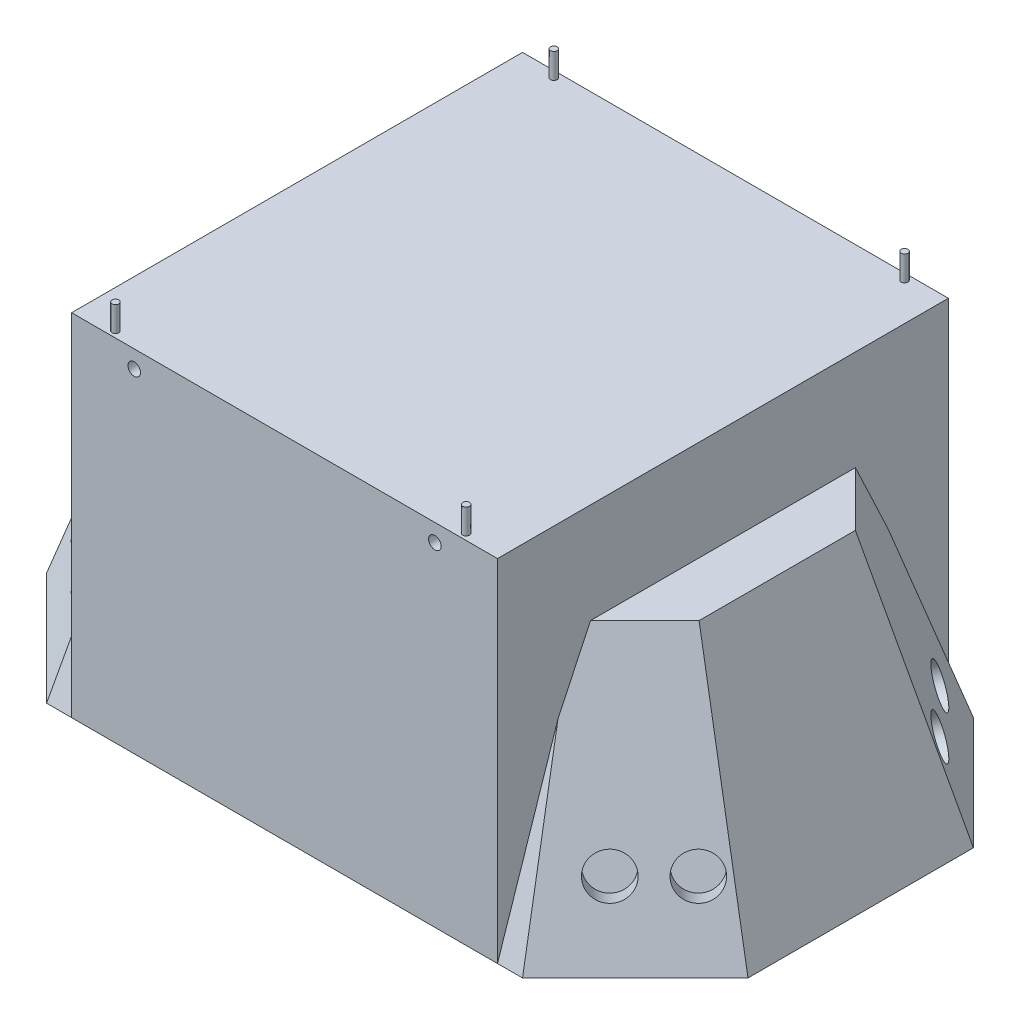
ISO-10303-21;
HEADER;
FILE_DESCRIPTION(('STEP AP214'),'2;1');
FILE_NAME('part.step','',(''),(''),'','','');
FILE_SCHEMA(('AUTOMOTIVE_DESIGN { 1 0 10303 214 1 1 1 1 }'));
ENDSEC;
DATA;
#1=APPLICATION_CONTEXT('core data for automotive mechanical design processes');
#2=APPLICATION_PROTOCOL_DEFINITION('international standard','automotive_design',2000,#1);
#3=PRODUCT_CONTEXT('',#1,'mechanical');
#4=PRODUCT('Part','Part','',(#3));
#5=PRODUCT_RELATED_PRODUCT_CATEGORY('part','',(#4));
#6=PRODUCT_DEFINITION_FORMATION('','',#4);
#7=PRODUCT_DEFINITION_CONTEXT('part definition',#1,'design');
#8=PRODUCT_DEFINITION('design','',#6,#7);
#9=PRODUCT_DEFINITION_SHAPE('','',#8);
#10=(LENGTH_UNIT() NAMED_UNIT(*) SI_UNIT(.MILLI.,.METRE.));
#11=(NAMED_UNIT(*) PLANE_ANGLE_UNIT() SI_UNIT($,.RADIAN.));
#12=(NAMED_UNIT(*) SI_UNIT($,.STERADIAN.) SOLID_ANGLE_UNIT());
#13=UNCERTAINTY_MEASURE_WITH_UNIT(LENGTH_MEASURE(1.E-05),#10,'distance_accuracy_value','');
#14=(GEOMETRIC_REPRESENTATION_CONTEXT(3) GLOBAL_UNCERTAINTY_ASSIGNED_CONTEXT((#13)) GLOBAL_UNIT_ASSIGNED_CONTEXT((#10,
#11,#12)) REPRESENTATION_CONTEXT('',''));
#15=CARTESIAN_POINT('',(0.,0.,0.));
#16=DIRECTION('',(0.,0.,1.));
#17=DIRECTION('',(1.,0.,0.));
#18=AXIS2_PLACEMENT_3D('',#15,#16,#17);
#19=CARTESIAN_POINT('',(-125.,0.,60.));
#20=DIRECTION('',(-0.670839704394397,0.316145823973806,0.670839704394397));
#21=DIRECTION('',(0.707106781186547,0.,0.707106781186548));
#22=AXIS2_PLACEMENT_3D('',#19,#20,#21);
#23=PLANE('',#22);
#24=CARTESIAN_POINT('',(-123.384186446424,28.4613182439874,48.2028821950348));
#25=DIRECTION('',(0.670839704394397,-0.316145823973806,-0.670839704394397));
#26=DIRECTION('',(-0.707106781186547,0.,-0.707106781186548));
#27=AXIS2_PLACEMENT_3D('',#24,#25,#26);
#28=CIRCLE('',#27,8.00000000000001);
#29=CARTESIAN_POINT('',(-129.041040695916,28.4613182439874,42.5460279455424));
#30=VERTEX_POINT('',#29);
#31=EDGE_CURVE('E391',#30,#30,#28,.T.);
#32=ORIENTED_EDGE('',*,*,#31,.T.);
#33=EDGE_LOOP('',(#32));
#34=FACE_BOUND('',#33,.T.);
#35=CARTESIAN_POINT('',(-105.70651691676,28.4613182439874,65.8805517246985));
#36=DIRECTION('',(0.670839704394397,-0.316145823973806,-0.670839704394397));
#37=DIRECTION('',(-0.707106781186547,0.,-0.707106781186548));
#38=AXIS2_PLACEMENT_3D('',#35,#36,#37);
#39=CIRCLE('',#38,8.00000000000001);
#40=CARTESIAN_POINT('',(-111.363371166253,28.4613182439874,60.2236974752061));
#41=VERTEX_POINT('',#40);
#42=EDGE_CURVE('E383',#41,#41,#39,.T.);
#43=ORIENTED_EDGE('',*,*,#42,.T.);
#44=EDGE_LOOP('',(#43));
#45=FACE_BOUND('',#44,.T.);
#46=DIRECTION('',(0.,0.904581379300352,-0.426300983136413));
#47=VECTOR('',#46,1.);
#48=CARTESIAN_POINT('',(-85.,15.4249572529053,92.7306988710771));
#49=LINE('',#48,#47);
#50=CARTESIAN_POINT('',(-85.,100.,52.873119777666));
#51=VERTEX_POINT('',#50);
#52=CARTESIAN_POINT('',(-85.,72.4472646240448,65.8578643762691));
#53=VERTEX_POINT('',#52);
#54=EDGE_CURVE('E174',#51,#53,#49,.F.);
#55=ORIENTED_EDGE('',*,*,#54,.F.);
#56=DIRECTION('',(-0.707106781186547,0.,-0.707106781186548));
#57=VECTOR('',#56,1.);
#58=CARTESIAN_POINT('',(-101.436559888833,100.,36.436559888833));
#59=LINE('',#58,#57);
#60=CARTESIAN_POINT('',(-106.676263418621,100.,31.1968563590446));
#61=VERTEX_POINT('',#60);
#62=EDGE_CURVE('E294',#61,#51,#59,.F.);
#63=ORIENTED_EDGE('',*,*,#62,.F.);
#64=DIRECTION('',(-0.313469499168313,-0.940679321488459,0.129843317945817));
#65=VECTOR('',#64,1.);
#66=CARTESIAN_POINT('',(-139.13658189407,2.59100027339842,44.6423605105253));
#67=LINE('',#66,#65);
#68=CARTESIAN_POINT('',(-140.,0.,45.));
#69=VERTEX_POINT('',#68);
#70=EDGE_CURVE('E263',#61,#69,#67,.T.);
#71=ORIENTED_EDGE('',*,*,#70,.T.);
#72=DIRECTION('',(0.707106781186547,0.,0.707106781186548));
#73=VECTOR('',#72,1.);
#74=CARTESIAN_POINT('',(-125.,0.,60.));
#75=LINE('',#74,#73);
#76=CARTESIAN_POINT('',(-95.,0.,90.));
#77=VERTEX_POINT('',#76);
#78=EDGE_CURVE('E242',#69,#77,#75,.T.);
#79=ORIENTED_EDGE('',*,*,#78,.T.);
#80=DIRECTION('',(-0.129843317945817,-0.940679321488459,0.313469499168313));
#81=VECTOR('',#80,1.);
#82=CARTESIAN_POINT('',(-95.,0.,90.));
#83=LINE('',#82,#81);
#84=EDGE_CURVE('E161',#53,#77,#83,.T.);
#85=ORIENTED_EDGE('',*,*,#84,.F.);
#86=EDGE_LOOP('',(#55,#63,#71,#79,#85));
#87=FACE_BOUND('',#86,.T.);
#88=ADVANCED_FACE('F42',(#34,#45,#87),#23,.T.);
#89=CARTESIAN_POINT('',(-95.,0.,90.));
#90=DIRECTION('',(0.,0.316145823973806,0.948710608132914));
#91=DIRECTION('',(0.,-0.948710608132914,0.316145823973806));
#92=AXIS2_PLACEMENT_3D('',#89,#90,#91);
#93=PLANE('',#92);
#94=DIRECTION('',(0.,0.948710608132914,-0.316145823973806));
#95=VECTOR('',#94,1.);
#96=CARTESIAN_POINT('',(-85.,0.,90.));
#97=LINE('',#96,#95);
#98=CARTESIAN_POINT('',(-85.,0.,90.));
#99=VERTEX_POINT('',#98);
#100=EDGE_CURVE('E59',#53,#99,#97,.F.);
#101=ORIENTED_EDGE('',*,*,#100,.F.);
#102=ORIENTED_EDGE('',*,*,#84,.T.);
#103=DIRECTION('',(1.,0.,0.));
#104=VECTOR('',#103,1.);
#105=CARTESIAN_POINT('',(-95.,0.,90.));
#106=LINE('',#105,#104);
#107=EDGE_CURVE('E149',#77,#99,#106,.T.);
#108=ORIENTED_EDGE('',*,*,#107,.T.);
#109=EDGE_LOOP('',(#101,#102,#108));
#110=FACE_BOUND('',#109,.T.);
#111=ADVANCED_FACE('F160',(#110),#93,.T.);
#112=CARTESIAN_POINT('',(95.,0.,-90.));
#113=DIRECTION('',(0.,0.316145823973806,-0.948710608132914));
#114=DIRECTION('',(0.,0.948710608132914,0.316145823973806));
#115=AXIS2_PLACEMENT_3D('',#112,#113,#114);
#116=PLANE('',#115);
#117=DIRECTION('',(0.,-0.948710608132914,-0.316145823973806));
#118=VECTOR('',#117,1.);
#119=CARTESIAN_POINT('',(-85.,0.,-90.));
#120=LINE('',#119,#118);
#121=CARTESIAN_POINT('',(-85.,0.,-90.));
#122=VERTEX_POINT('',#121);
#123=CARTESIAN_POINT('',(-85.,72.4472646240446,-65.8578643762691));
#124=VERTEX_POINT('',#123);
#125=EDGE_CURVE('E176',#122,#124,#120,.F.);
#126=ORIENTED_EDGE('',*,*,#125,.F.);
#127=DIRECTION('',(-1.,0.,0.));
#128=VECTOR('',#127,1.);
#129=CARTESIAN_POINT('',(95.,0.,-90.));
#130=LINE('',#129,#128);
#131=CARTESIAN_POINT('',(-95.,0.,-90.));
#132=VERTEX_POINT('',#131);
#133=EDGE_CURVE('E254',#122,#132,#130,.T.);
#134=ORIENTED_EDGE('',*,*,#133,.T.);
#135=DIRECTION('',(-0.129843317945817,-0.940679321488459,-0.313469499168313));
#136=VECTOR('',#135,1.);
#137=CARTESIAN_POINT('',(-95.,0.,-90.));
#138=LINE('',#137,#136);
#139=EDGE_CURVE('E271',#124,#132,#138,.T.);
#140=ORIENTED_EDGE('',*,*,#139,.F.);
#141=EDGE_LOOP('',(#126,#134,#140));
#142=FACE_BOUND('',#141,.T.);
#143=ADVANCED_FACE('F447',(#142),#116,.T.);
#144=CARTESIAN_POINT('',(-95.,0.,-90.));
#145=DIRECTION('',(-0.670839704394397,0.316145823973806,-0.670839704394397));
#146=DIRECTION('',(-0.707106781186547,0.,0.707106781186548));
#147=AXIS2_PLACEMENT_3D('',#144,#145,#146);
#148=PLANE('',#147);
#149=CARTESIAN_POINT('',(-123.384186446424,28.4613182439874,-48.2028821950348));
#150=DIRECTION('',(-0.670839704394397,0.316145823973806,-0.670839704394397));
#151=DIRECTION('',(-0.707106781186547,0.,0.707106781186548));
#152=AXIS2_PLACEMENT_3D('',#149,#150,#151);
#153=CIRCLE('',#152,8.00000000000001);
#154=CARTESIAN_POINT('',(-129.041040695916,28.4613182439874,-42.5460279455424));
#155=VERTEX_POINT('',#154);
#156=EDGE_CURVE('E371',#155,#155,#153,.T.);
#157=ORIENTED_EDGE('',*,*,#156,.F.);
#158=EDGE_LOOP('',(#157));
#159=FACE_BOUND('',#158,.T.);
#160=CARTESIAN_POINT('',(-105.70651691676,28.4613182439874,-65.8805517246985));
#161=DIRECTION('',(-0.670839704394397,0.316145823973806,-0.670839704394397));
#162=DIRECTION('',(-0.707106781186547,0.,0.707106781186548));
#163=AXIS2_PLACEMENT_3D('',#160,#161,#162);
#164=CIRCLE('',#163,8.00000000000001);
#165=CARTESIAN_POINT('',(-111.363371166253,28.4613182439874,-60.2236974752061));
#166=VERTEX_POINT('',#165);
#167=EDGE_CURVE('E367',#166,#166,#164,.T.);
#168=ORIENTED_EDGE('',*,*,#167,.F.);
#169=EDGE_LOOP('',(#168));
#170=FACE_BOUND('',#169,.T.);
#171=DIRECTION('',(0.,-0.904581379300352,-0.426300983136413));
#172=VECTOR('',#171,1.);
#173=CARTESIAN_POINT('',(-85.,3.85623931322632,-98.1826747177692));
#174=LINE('',#173,#172);
#175=CARTESIAN_POINT('',(-85.,100.,-52.873119777666));
#176=VERTEX_POINT('',#175);
#177=EDGE_CURVE('E234',#124,#176,#174,.F.);
#178=ORIENTED_EDGE('',*,*,#177,.F.);
#179=ORIENTED_EDGE('',*,*,#139,.T.);
#180=DIRECTION('',(-0.707106781186547,0.,0.707106781186548));
#181=VECTOR('',#180,1.);
#182=CARTESIAN_POINT('',(-95.,0.,-90.));
#183=LINE('',#182,#181);
#184=CARTESIAN_POINT('',(-140.,0.,-45.));
#185=VERTEX_POINT('',#184);
#186=EDGE_CURVE('E259',#132,#185,#183,.T.);
#187=ORIENTED_EDGE('',*,*,#186,.T.);
#188=DIRECTION('',(-0.313469499168313,-0.940679321488459,-0.129843317945817));
#189=VECTOR('',#188,1.);
#190=CARTESIAN_POINT('',(-140.,0.,-45.));
#191=LINE('',#190,#189);
#192=CARTESIAN_POINT('',(-106.676263418621,100.,-31.1968563590446));
#193=VERTEX_POINT('',#192);
#194=EDGE_CURVE('E267',#193,#185,#191,.T.);
#195=ORIENTED_EDGE('',*,*,#194,.F.);
#196=DIRECTION('',(0.707106781186547,0.,-0.707106781186548));
#197=VECTOR('',#196,1.);
#198=CARTESIAN_POINT('',(-71.436559888833,100.,-66.436559888833));
#199=LINE('',#198,#197);
#200=EDGE_CURVE('E272',#176,#193,#199,.F.);
#201=ORIENTED_EDGE('',*,*,#200,.F.);
#202=EDGE_LOOP('',(#178,#179,#187,#195,#201));
#203=FACE_BOUND('',#202,.T.);
#204=ADVANCED_FACE('F461',(#159,#170,#203),#148,.T.);
#205=CARTESIAN_POINT('',(0.,100.,0.));
#206=DIRECTION('',(0.,1.,0.));
#207=DIRECTION('',(0.,0.,1.));
#208=AXIS2_PLACEMENT_3D('',#205,#206,#207);
#209=PLANE('',#208);
#210=ORIENTED_EDGE('',*,*,#62,.T.);
#211=DIRECTION('',(0.,0.,-1.));
#212=VECTOR('',#211,1.);
#213=CARTESIAN_POINT('',(-85.,100.,0.));
#214=LINE('',#213,#212);
#215=EDGE_CURVE('E231',#51,#176,#214,.T.);
#216=ORIENTED_EDGE('',*,*,#215,.T.);
#217=ORIENTED_EDGE('',*,*,#200,.T.);
#218=DIRECTION('',(0.,0.,-1.));
#219=VECTOR('',#218,1.);
#220=CARTESIAN_POINT('',(-106.676263418621,100.,-45.));
#221=LINE('',#220,#219);
#222=EDGE_CURVE('E262',#193,#61,#221,.F.);
#223=ORIENTED_EDGE('',*,*,#222,.T.);
#224=EDGE_LOOP('',(#210,#216,#217,#223));
#225=FACE_BOUND('',#224,.T.);
#226=ADVANCED_FACE('F454',(#225),#209,.T.);
#227=CARTESIAN_POINT('',(-140.,0.,-45.));
#228=DIRECTION('',(-0.948710608132914,0.316145823973806,0.));
#229=DIRECTION('',(-0.316145823973807,-0.948710608132914,0.));
#230=AXIS2_PLACEMENT_3D('',#227,#228,#229);
#231=PLANE('',#230);
#232=DIRECTION('',(0.,0.,1.));
#233=VECTOR('',#232,1.);
#234=CARTESIAN_POINT('',(-140.,0.,-45.));
#235=LINE('',#234,#233);
#236=EDGE_CURVE('E238',#185,#69,#235,.T.);
#237=ORIENTED_EDGE('',*,*,#236,.T.);
#238=ORIENTED_EDGE('',*,*,#70,.F.);
#239=ORIENTED_EDGE('',*,*,#222,.F.);
#240=ORIENTED_EDGE('',*,*,#194,.T.);
#241=EDGE_LOOP('',(#237,#238,#239,#240));
#242=FACE_BOUND('',#241,.T.);
#243=ADVANCED_FACE('F470',(#242),#231,.T.);
#244=CARTESIAN_POINT('',(-85.,-50.,90.));
#245=DIRECTION('',(1.,0.,0.));
#246=DIRECTION('',(0.,1.,0.));
#247=AXIS2_PLACEMENT_3D('',#244,#245,#246);
#248=PLANE('',#247);
#249=ORIENTED_EDGE('',*,*,#125,.T.);
#250=ORIENTED_EDGE('',*,*,#177,.T.);
#251=ORIENTED_EDGE('',*,*,#215,.F.);
#252=ORIENTED_EDGE('',*,*,#54,.T.);
#253=ORIENTED_EDGE('',*,*,#100,.T.);
#254=DIRECTION('',(0.,-1.,0.));
#255=VECTOR('',#254,1.);
#256=CARTESIAN_POINT('',(-85.,-50.,90.));
#257=LINE('',#256,#255);
#258=CARTESIAN_POINT('',(-85.,140.,90.));
#259=VERTEX_POINT('',#258);
#260=EDGE_CURVE('E172',#259,#99,#257,.T.);
#261=ORIENTED_EDGE('',*,*,#260,.F.);
#262=DIRECTION('',(0.,0.,-1.));
#263=VECTOR('',#262,1.);
#264=CARTESIAN_POINT('',(-85.,140.,90.));
#265=LINE('',#264,#263);
#266=CARTESIAN_POINT('',(-85.,140.,-90.));
#267=VERTEX_POINT('',#266);
#268=EDGE_CURVE('E197',#259,#267,#265,.T.);
#269=ORIENTED_EDGE('',*,*,#268,.T.);
#270=DIRECTION('',(0.,-1.,0.));
#271=VECTOR('',#270,1.);
#272=CARTESIAN_POINT('',(-85.,-50.,-90.));
#273=LINE('',#272,#271);
#274=EDGE_CURVE('E198',#267,#122,#273,.T.);
#275=ORIENTED_EDGE('',*,*,#274,.T.);
#276=EDGE_LOOP('',(#249,#250,#251,#252,#253,#261,#269,#275));
#277=FACE_BOUND('',#276,.T.);
#278=ADVANCED_FACE('F170',(#277),#248,.F.);
#279=CARTESIAN_POINT('',(85.,140.,90.));
#280=DIRECTION('',(-1.,0.,0.));
#281=DIRECTION('',(0.,-1.,0.));
#282=AXIS2_PLACEMENT_3D('',#279,#280,#281);
#283=PLANE('',#282);
#284=DIRECTION('',(0.,-0.948710608132914,0.316145823973806));
#285=VECTOR('',#284,1.);
#286=CARTESIAN_POINT('',(85.,0.,90.));
#287=LINE('',#286,#285);
#288=CARTESIAN_POINT('',(85.,0.,90.));
#289=VERTEX_POINT('',#288);
#290=CARTESIAN_POINT('',(85.,72.4472646240448,65.8578643762691));
#291=VERTEX_POINT('',#290);
#292=EDGE_CURVE('E218',#289,#291,#287,.F.);
#293=ORIENTED_EDGE('',*,*,#292,.T.);
#294=DIRECTION('',(0.,-0.904581379300352,0.426300983136413));
#295=VECTOR('',#294,1.);
#296=CARTESIAN_POINT('',(85.,3.85623931322631,98.1826747177692));
#297=LINE('',#296,#295);
#298=CARTESIAN_POINT('',(85.,100.,52.873119777666));
#299=VERTEX_POINT('',#298);
#300=EDGE_CURVE('E67',#291,#299,#297,.F.);
#301=ORIENTED_EDGE('',*,*,#300,.T.);
#302=DIRECTION('',(0.,0.,1.));
#303=VECTOR('',#302,1.);
#304=CARTESIAN_POINT('',(85.,100.,0.));
#305=LINE('',#304,#303);
#306=CARTESIAN_POINT('',(85.,100.,-52.8731197776661));
#307=VERTEX_POINT('',#306);
#308=EDGE_CURVE('E222',#307,#299,#305,.T.);
#309=ORIENTED_EDGE('',*,*,#308,.F.);
#310=DIRECTION('',(0.,0.904581379300352,0.426300983136413));
#311=VECTOR('',#310,1.);
#312=CARTESIAN_POINT('',(85.,21.2093162227448,-90.004710947731));
#313=LINE('',#312,#311);
#314=CARTESIAN_POINT('',(85.,72.4472646240448,-65.8578643762691));
#315=VERTEX_POINT('',#314);
#316=EDGE_CURVE('E214',#307,#315,#313,.F.);
#317=ORIENTED_EDGE('',*,*,#316,.T.);
#318=DIRECTION('',(0.,0.948710608132914,0.316145823973806));
#319=VECTOR('',#318,1.);
#320=CARTESIAN_POINT('',(85.,0.,-90.));
#321=LINE('',#320,#319);
#322=CARTESIAN_POINT('',(85.,0.,-90.));
#323=VERTEX_POINT('',#322);
#324=EDGE_CURVE('E210',#315,#323,#321,.F.);
#325=ORIENTED_EDGE('',*,*,#324,.T.);
#326=DIRECTION('',(0.,1.,0.));
#327=VECTOR('',#326,1.);
#328=CARTESIAN_POINT('',(85.,140.,-90.));
#329=LINE('',#328,#327);
#330=CARTESIAN_POINT('',(85.,140.,-90.));
#331=VERTEX_POINT('',#330);
#332=EDGE_CURVE('E189',#323,#331,#329,.T.);
#333=ORIENTED_EDGE('',*,*,#332,.T.);
#334=DIRECTION('',(0.,0.,-1.));
#335=VECTOR('',#334,1.);
#336=CARTESIAN_POINT('',(85.,140.,90.));
#337=LINE('',#336,#335);
#338=CARTESIAN_POINT('',(85.,140.,90.));
#339=VERTEX_POINT('',#338);
#340=EDGE_CURVE('E206',#339,#331,#337,.T.);
#341=ORIENTED_EDGE('',*,*,#340,.F.);
#342=DIRECTION('',(0.,1.,0.));
#343=VECTOR('',#342,1.);
#344=CARTESIAN_POINT('',(85.,140.,90.));
#345=LINE('',#344,#343);
#346=EDGE_CURVE('E183',#289,#339,#345,.T.);
#347=ORIENTED_EDGE('',*,*,#346,.F.);
#348=EDGE_LOOP('',(#293,#301,#309,#317,#325,#333,#341,#347));
#349=FACE_BOUND('',#348,.T.);
#350=ADVANCED_FACE('F477',(#349),#283,.F.);
#351=CARTESIAN_POINT('',(0.,0.,90.));
#352=DIRECTION('',(0.,0.,-1.));
#353=DIRECTION('',(-1.,0.,0.));
#354=AXIS2_PLACEMENT_3D('',#351,#352,#353);
#355=PLANE('',#354);
#356=CARTESIAN_POINT('',(60.,133.,90.));
#357=DIRECTION('',(0.,0.,-1.));
#358=DIRECTION('',(-1.,0.,0.));
#359=AXIS2_PLACEMENT_3D('',#356,#357,#358);
#360=CIRCLE('',#359,2.5);
#361=CARTESIAN_POINT('',(57.5,133.,90.));
#362=VERTEX_POINT('',#361);
#363=EDGE_CURVE('E360',#362,#362,#360,.T.);
#364=ORIENTED_EDGE('',*,*,#363,.T.);
#365=EDGE_LOOP('',(#364));
#366=FACE_BOUND('',#365,.T.);
#367=CARTESIAN_POINT('',(-60.,133.,90.));
#368=DIRECTION('',(0.,0.,-1.));
#369=DIRECTION('',(-1.,0.,0.));
#370=AXIS2_PLACEMENT_3D('',#367,#368,#369);
#371=CIRCLE('',#370,2.5);
#372=CARTESIAN_POINT('',(-62.5,133.,90.));
#373=VERTEX_POINT('',#372);
#374=EDGE_CURVE('E351',#373,#373,#371,.T.);
#375=ORIENTED_EDGE('',*,*,#374,.T.);
#376=EDGE_LOOP('',(#375));
#377=FACE_BOUND('',#376,.T.);
#378=ORIENTED_EDGE('',*,*,#260,.T.);
#379=DIRECTION('',(-1.,0.,0.));
#380=VECTOR('',#379,1.);
#381=CARTESIAN_POINT('',(140.,0.,90.));
#382=LINE('',#381,#380);
#383=EDGE_CURVE('E147',#289,#99,#382,.T.);
#384=ORIENTED_EDGE('',*,*,#383,.F.);
#385=ORIENTED_EDGE('',*,*,#346,.T.);
#386=DIRECTION('',(-1.,0.,0.));
#387=VECTOR('',#386,1.);
#388=CARTESIAN_POINT('',(-85.,140.,90.));
#389=LINE('',#388,#387);
#390=EDGE_CURVE('E180',#339,#259,#389,.T.);
#391=ORIENTED_EDGE('',*,*,#390,.T.);
#392=EDGE_LOOP('',(#378,#384,#385,#391));
#393=FACE_BOUND('',#392,.T.);
#394=ADVANCED_FACE('F178',(#366,#377,#393),#355,.F.);
#395=CARTESIAN_POINT('',(0.,0.,-90.));
#396=DIRECTION('',(0.,0.,-1.));
#397=DIRECTION('',(-1.,0.,0.));
#398=AXIS2_PLACEMENT_3D('',#395,#396,#397);
#399=PLANE('',#398);
#400=CARTESIAN_POINT('',(60.,133.,-90.));
#401=DIRECTION('',(0.,0.,-1.));
#402=DIRECTION('',(-1.,0.,0.));
#403=AXIS2_PLACEMENT_3D('',#400,#401,#402);
#404=CIRCLE('',#403,2.5);
#405=CARTESIAN_POINT('',(57.5,133.,-90.));
#406=VERTEX_POINT('',#405);
#407=EDGE_CURVE('E344',#406,#406,#404,.T.);
#408=ORIENTED_EDGE('',*,*,#407,.F.);
#409=EDGE_LOOP('',(#408));
#410=FACE_BOUND('',#409,.T.);
#411=CARTESIAN_POINT('',(-60.,133.,-90.));
#412=DIRECTION('',(0.,0.,-1.));
#413=DIRECTION('',(-1.,0.,0.));
#414=AXIS2_PLACEMENT_3D('',#411,#412,#413);
#415=CIRCLE('',#414,2.5);
#416=CARTESIAN_POINT('',(-62.5,133.,-90.));
#417=VERTEX_POINT('',#416);
#418=EDGE_CURVE('E339',#417,#417,#415,.T.);
#419=ORIENTED_EDGE('',*,*,#418,.F.);
#420=EDGE_LOOP('',(#419));
#421=FACE_BOUND('',#420,.T.);
#422=DIRECTION('',(-1.,0.,0.));
#423=VECTOR('',#422,1.);
#424=CARTESIAN_POINT('',(140.,0.,-90.));
#425=LINE('',#424,#423);
#426=EDGE_CURVE('E157',#323,#122,#425,.T.);
#427=ORIENTED_EDGE('',*,*,#426,.T.);
#428=ORIENTED_EDGE('',*,*,#274,.F.);
#429=DIRECTION('',(-1.,0.,0.));
#430=VECTOR('',#429,1.);
#431=CARTESIAN_POINT('',(-85.,140.,-90.));
#432=LINE('',#431,#430);
#433=EDGE_CURVE('E184',#331,#267,#432,.T.);
#434=ORIENTED_EDGE('',*,*,#433,.F.);
#435=ORIENTED_EDGE('',*,*,#332,.F.);
#436=EDGE_LOOP('',(#427,#428,#434,#435));
#437=FACE_BOUND('',#436,.T.);
#438=ADVANCED_FACE('F620',(#410,#421,#437),#399,.T.);
#439=CARTESIAN_POINT('',(-85.,140.,90.));
#440=DIRECTION('',(0.,-1.,0.));
#441=DIRECTION('',(0.,0.,-1.));
#442=AXIS2_PLACEMENT_3D('',#439,#440,#441);
#443=PLANE('',#442);
#444=CARTESIAN_POINT('',(70.,140.,87.5));
#445=DIRECTION('',(0.,-1.,0.));
#446=DIRECTION('',(0.,0.,-1.));
#447=AXIS2_PLACEMENT_3D('',#444,#445,#446);
#448=CIRCLE('',#447,1.35000000000001);
#449=CARTESIAN_POINT('',(70.,140.,86.15));
#450=VERTEX_POINT('',#449);
#451=EDGE_CURVE('E45',#450,#450,#448,.T.);
#452=ORIENTED_EDGE('',*,*,#451,.T.);
#453=EDGE_LOOP('',(#452));
#454=FACE_BOUND('',#453,.T.);
#455=CARTESIAN_POINT('',(-70.,140.,87.5));
#456=DIRECTION('',(0.,-1.,0.));
#457=DIRECTION('',(0.,0.,-1.));
#458=AXIS2_PLACEMENT_3D('',#455,#456,#457);
#459=CIRCLE('',#458,1.35000000000001);
#460=CARTESIAN_POINT('',(-70.,140.,86.15));
#461=VERTEX_POINT('',#460);
#462=EDGE_CURVE('E312',#461,#461,#459,.T.);
#463=ORIENTED_EDGE('',*,*,#462,.T.);
#464=EDGE_LOOP('',(#463));
#465=FACE_BOUND('',#464,.T.);
#466=CARTESIAN_POINT('',(70.,140.,-87.5));
#467=DIRECTION('',(0.,-1.,0.));
#468=DIRECTION('',(0.,0.,-1.));
#469=AXIS2_PLACEMENT_3D('',#466,#467,#468);
#470=CIRCLE('',#469,1.35000000000001);
#471=CARTESIAN_POINT('',(70.,140.,-88.85));
#472=VERTEX_POINT('',#471);
#473=EDGE_CURVE('E11',#472,#472,#470,.F.);
#474=ORIENTED_EDGE('',*,*,#473,.F.);
#475=EDGE_LOOP('',(#474));
#476=FACE_BOUND('',#475,.T.);
#477=CARTESIAN_POINT('',(-70.,140.,-87.5));
#478=DIRECTION('',(0.,-1.,0.));
#479=DIRECTION('',(0.,0.,-1.));
#480=AXIS2_PLACEMENT_3D('',#477,#478,#479);
#481=CIRCLE('',#480,1.35000000000001);
#482=CARTESIAN_POINT('',(-70.,140.,-88.85));
#483=VERTEX_POINT('',#482);
#484=EDGE_CURVE('E51',#483,#483,#481,.F.);
#485=ORIENTED_EDGE('',*,*,#484,.F.);
#486=EDGE_LOOP('',(#485));
#487=FACE_BOUND('',#486,.T.);
#488=ORIENTED_EDGE('',*,*,#433,.T.);
#489=ORIENTED_EDGE('',*,*,#268,.F.);
#490=ORIENTED_EDGE('',*,*,#390,.F.);
#491=ORIENTED_EDGE('',*,*,#340,.T.);
#492=EDGE_LOOP('',(#488,#489,#490,#491));
#493=FACE_BOUND('',#492,.T.);
#494=ADVANCED_FACE('F497',(#454,#465,#476,#487,#493),#443,.F.);
#495=CARTESIAN_POINT('',(140.,0.,45.));
#496=DIRECTION('',(0.948710608132914,0.316145823973806,0.));
#497=DIRECTION('',(-0.316145823973806,0.948710608132914,0.));
#498=AXIS2_PLACEMENT_3D('',#495,#496,#497);
#499=PLANE('',#498);
#500=DIRECTION('',(0.,0.,-1.));
#501=VECTOR('',#500,1.);
#502=CARTESIAN_POINT('',(140.,0.,45.));
#503=LINE('',#502,#501);
#504=CARTESIAN_POINT('',(140.,0.,45.));
#505=VERTEX_POINT('',#504);
#506=CARTESIAN_POINT('',(140.,0.,-45.0000000000001));
#507=VERTEX_POINT('',#506);
#508=EDGE_CURVE('E247',#505,#507,#503,.T.);
#509=ORIENTED_EDGE('',*,*,#508,.T.);
#510=DIRECTION('',(0.313469499168313,-0.940679321488459,-0.129843317945817));
#511=VECTOR('',#510,1.);
#512=CARTESIAN_POINT('',(140.,0.,-45.0000000000001));
#513=LINE('',#512,#511);
#514=CARTESIAN_POINT('',(106.676263418621,100.,-31.1968563590446));
#515=VERTEX_POINT('',#514);
#516=EDGE_CURVE('E278',#515,#507,#513,.T.);
#517=ORIENTED_EDGE('',*,*,#516,.F.);
#518=DIRECTION('',(0.,0.,1.));
#519=VECTOR('',#518,1.);
#520=CARTESIAN_POINT('',(106.676263418621,100.,45.));
#521=LINE('',#520,#519);
#522=CARTESIAN_POINT('',(106.676263418621,100.,31.1968563590446));
#523=VERTEX_POINT('',#522);
#524=EDGE_CURVE('E301',#523,#515,#521,.F.);
#525=ORIENTED_EDGE('',*,*,#524,.F.);
#526=DIRECTION('',(0.313469499168313,-0.940679321488459,0.129843317945817));
#527=VECTOR('',#526,1.);
#528=CARTESIAN_POINT('',(140.,0.,45.));
#529=LINE('',#528,#527);
#530=EDGE_CURVE('E282',#523,#505,#529,.T.);
#531=ORIENTED_EDGE('',*,*,#530,.T.);
#532=EDGE_LOOP('',(#509,#517,#525,#531));
#533=FACE_BOUND('',#532,.T.);
#534=ADVANCED_FACE('F494',(#533),#499,.T.);
#535=CARTESIAN_POINT('',(0.,0.,0.));
#536=DIRECTION('',(0.,1.,0.));
#537=DIRECTION('',(0.,0.,1.));
#538=AXIS2_PLACEMENT_3D('',#535,#536,#537);
#539=PLANE('',#538);
#540=CARTESIAN_POINT('',(95.,0.,90.));
#541=VERTEX_POINT('',#540);
#542=EDGE_CURVE('E152',#289,#541,#106,.T.);
#543=ORIENTED_EDGE('',*,*,#542,.F.);
#544=ORIENTED_EDGE('',*,*,#383,.T.);
#545=ORIENTED_EDGE('',*,*,#107,.F.);
#546=ORIENTED_EDGE('',*,*,#78,.F.);
#547=ORIENTED_EDGE('',*,*,#236,.F.);
#548=ORIENTED_EDGE('',*,*,#186,.F.);
#549=ORIENTED_EDGE('',*,*,#133,.F.);
#550=ORIENTED_EDGE('',*,*,#426,.F.);
#551=CARTESIAN_POINT('',(95.,0.,-90.));
#552=VERTEX_POINT('',#551);
#553=EDGE_CURVE('E255',#552,#323,#130,.T.);
#554=ORIENTED_EDGE('',*,*,#553,.F.);
#555=DIRECTION('',(-0.707106781186548,0.,-0.707106781186547));
#556=VECTOR('',#555,1.);
#557=CARTESIAN_POINT('',(140.,0.,-45.0000000000001));
#558=LINE('',#557,#556);
#559=EDGE_CURVE('E250',#507,#552,#558,.T.);
#560=ORIENTED_EDGE('',*,*,#559,.F.);
#561=ORIENTED_EDGE('',*,*,#508,.F.);
#562=DIRECTION('',(0.707106781186547,0.,-0.707106781186547));
#563=VECTOR('',#562,1.);
#564=CARTESIAN_POINT('',(95.,0.,90.));
#565=LINE('',#564,#563);
#566=EDGE_CURVE('E164',#541,#505,#565,.T.);
#567=ORIENTED_EDGE('',*,*,#566,.F.);
#568=EDGE_LOOP('',(#543,#544,#545,#546,#547,#548,#549,#550,#554,#560,#561,#567));
#569=FACE_BOUND('',#568,.T.);
#570=ADVANCED_FACE('F148',(#569),#539,.F.);
#571=ORIENTED_EDGE('',*,*,#324,.F.);
#572=DIRECTION('',(0.129843317945817,-0.940679321488459,-0.313469499168313));
#573=VECTOR('',#572,1.);
#574=CARTESIAN_POINT('',(95.,0.,-90.));
#575=LINE('',#574,#573);
#576=EDGE_CURVE('E275',#315,#552,#575,.T.);
#577=ORIENTED_EDGE('',*,*,#576,.T.);
#578=ORIENTED_EDGE('',*,*,#553,.T.);
#579=EDGE_LOOP('',(#571,#577,#578));
#580=FACE_BOUND('',#579,.T.);
#581=ADVANCED_FACE('F488',(#580),#116,.T.);
#582=DIRECTION('',(0.707106781186547,0.,0.707106781186547));
#583=VECTOR('',#582,1.);
#584=CARTESIAN_POINT('',(116.436559888833,100.,-21.4365598888331));
#585=LINE('',#584,#583);
#586=EDGE_CURVE('E304',#515,#307,#585,.F.);
#587=ORIENTED_EDGE('',*,*,#586,.T.);
#588=ORIENTED_EDGE('',*,*,#308,.T.);
#589=DIRECTION('',(-0.707106781186548,0.,0.707106781186548));
#590=VECTOR('',#589,1.);
#591=CARTESIAN_POINT('',(71.436559888833,100.,66.436559888833));
#592=LINE('',#591,#590);
#593=EDGE_CURVE('E298',#299,#523,#592,.F.);
#594=ORIENTED_EDGE('',*,*,#593,.T.);
#595=ORIENTED_EDGE('',*,*,#524,.T.);
#596=EDGE_LOOP('',(#587,#588,#594,#595));
#597=FACE_BOUND('',#596,.T.);
#598=ADVANCED_FACE('F480',(#597),#209,.T.);
#599=CARTESIAN_POINT('',(140.,0.,-45.0000000000001));
#600=DIRECTION('',(0.670839704394397,0.316145823973806,-0.670839704394397));
#601=DIRECTION('',(-0.707106781186547,0.,-0.707106781186547));
#602=AXIS2_PLACEMENT_3D('',#599,#600,#601);
#603=PLANE('',#602);
#604=CARTESIAN_POINT('',(123.384186446424,28.4613182439874,-48.2028821950348));
#605=DIRECTION('',(-0.670839704394397,-0.316145823973806,0.670839704394397));
#606=DIRECTION('',(0.707106781186547,0.,0.707106781186548));
#607=AXIS2_PLACEMENT_3D('',#604,#605,#606);
#608=CIRCLE('',#607,8.00000000000001);
#609=CARTESIAN_POINT('',(129.041040695916,28.4613182439874,-42.5460279455424));
#610=VERTEX_POINT('',#609);
#611=EDGE_CURVE('E423',#610,#610,#608,.T.);
#612=ORIENTED_EDGE('',*,*,#611,.T.);
#613=EDGE_LOOP('',(#612));
#614=FACE_BOUND('',#613,.T.);
#615=CARTESIAN_POINT('',(105.70651691676,28.4613182439874,-65.8805517246985));
#616=DIRECTION('',(-0.670839704394397,-0.316145823973806,0.670839704394397));
#617=DIRECTION('',(0.707106781186547,0.,0.707106781186548));
#618=AXIS2_PLACEMENT_3D('',#615,#616,#617);
#619=CIRCLE('',#618,8.00000000000001);
#620=CARTESIAN_POINT('',(111.363371166253,28.4613182439874,-60.2236974752061));
#621=VERTEX_POINT('',#620);
#622=EDGE_CURVE('E415',#621,#621,#619,.T.);
#623=ORIENTED_EDGE('',*,*,#622,.T.);
#624=EDGE_LOOP('',(#623));
#625=FACE_BOUND('',#624,.T.);
#626=ORIENTED_EDGE('',*,*,#316,.F.);
#627=ORIENTED_EDGE('',*,*,#586,.F.);
#628=ORIENTED_EDGE('',*,*,#516,.T.);
#629=ORIENTED_EDGE('',*,*,#559,.T.);
#630=ORIENTED_EDGE('',*,*,#576,.F.);
#631=EDGE_LOOP('',(#626,#627,#628,#629,#630));
#632=FACE_BOUND('',#631,.T.);
#633=ADVANCED_FACE('F489',(#614,#625,#632),#603,.T.);
#634=CARTESIAN_POINT('',(95.,0.,90.));
#635=DIRECTION('',(0.670839704394397,0.316145823973806,0.670839704394397));
#636=DIRECTION('',(0.707106781186548,0.,-0.707106781186548));
#637=AXIS2_PLACEMENT_3D('',#634,#635,#636);
#638=PLANE('',#637);
#639=CARTESIAN_POINT('',(123.384186446424,28.4613182439874,48.2028821950348));
#640=DIRECTION('',(0.670839704394397,0.316145823973806,0.670839704394397));
#641=DIRECTION('',(0.707106781186547,0.,-0.707106781186548));
#642=AXIS2_PLACEMENT_3D('',#639,#640,#641);
#643=CIRCLE('',#642,8.00000000000001);
#644=CARTESIAN_POINT('',(129.041040695916,28.4613182439874,42.5460279455424));
#645=VERTEX_POINT('',#644);
#646=EDGE_CURVE('E407',#645,#645,#643,.T.);
#647=ORIENTED_EDGE('',*,*,#646,.F.);
#648=EDGE_LOOP('',(#647));
#649=FACE_BOUND('',#648,.T.);
#650=CARTESIAN_POINT('',(105.70651691676,28.4613182439874,65.8805517246985));
#651=DIRECTION('',(0.670839704394397,0.316145823973806,0.670839704394397));
#652=DIRECTION('',(0.707106781186547,0.,-0.707106781186548));
#653=AXIS2_PLACEMENT_3D('',#650,#651,#652);
#654=CIRCLE('',#653,8.00000000000001);
#655=CARTESIAN_POINT('',(111.363371166253,28.4613182439874,60.2236974752061));
#656=VERTEX_POINT('',#655);
#657=EDGE_CURVE('E399',#656,#656,#654,.T.);
#658=ORIENTED_EDGE('',*,*,#657,.F.);
#659=EDGE_LOOP('',(#658));
#660=FACE_BOUND('',#659,.T.);
#661=ORIENTED_EDGE('',*,*,#300,.F.);
#662=DIRECTION('',(0.129843317945817,-0.940679321488459,0.313469499168313));
#663=VECTOR('',#662,1.);
#664=CARTESIAN_POINT('',(95.,0.,90.));
#665=LINE('',#664,#663);
#666=EDGE_CURVE('E286',#291,#541,#665,.T.);
#667=ORIENTED_EDGE('',*,*,#666,.T.);
#668=ORIENTED_EDGE('',*,*,#566,.T.);
#669=ORIENTED_EDGE('',*,*,#530,.F.);
#670=ORIENTED_EDGE('',*,*,#593,.F.);
#671=EDGE_LOOP('',(#661,#667,#668,#669,#670));
#672=FACE_BOUND('',#671,.T.);
#673=ADVANCED_FACE('F492',(#649,#660,#672),#638,.T.);
#674=ORIENTED_EDGE('',*,*,#292,.F.);
#675=ORIENTED_EDGE('',*,*,#542,.T.);
#676=ORIENTED_EDGE('',*,*,#666,.F.);
#677=EDGE_LOOP('',(#674,#675,#676));
#678=FACE_BOUND('',#677,.T.);
#679=ADVANCED_FACE('F448',(#678),#93,.T.);
#680=CARTESIAN_POINT('',(-70.,150.,-87.5));
#681=DIRECTION('',(0.,-1.,0.));
#682=DIRECTION('',(0.,0.,-1.));
#683=AXIS2_PLACEMENT_3D('',#680,#681,#682);
#684=CYLINDRICAL_SURFACE('',#683,1.35000000000001);
#685=CARTESIAN_POINT('',(-70.,150.,-87.5));
#686=DIRECTION('',(0.,1.,0.));
#687=DIRECTION('',(0.,0.,1.));
#688=AXIS2_PLACEMENT_3D('',#685,#686,#687);
#689=CIRCLE('',#688,1.35000000000001);
#690=CARTESIAN_POINT('',(-70.,150.,-86.15));
#691=VERTEX_POINT('',#690);
#692=EDGE_CURVE('E192',#691,#691,#689,.T.);
#693=ORIENTED_EDGE('',*,*,#692,.F.);
#694=EDGE_LOOP('',(#693));
#695=FACE_BOUND('',#694,.T.);
#696=ORIENTED_EDGE('',*,*,#484,.T.);
#697=EDGE_LOOP('',(#696));
#698=FACE_BOUND('',#697,.T.);
#699=ADVANCED_FACE('F504',(#695,#698),#684,.T.);
#700=CARTESIAN_POINT('',(-70.,150.,-87.5));
#701=DIRECTION('',(0.,1.,0.));
#702=DIRECTION('',(0.,0.,1.));
#703=AXIS2_PLACEMENT_3D('',#700,#701,#702);
#704=PLANE('',#703);
#705=ORIENTED_EDGE('',*,*,#692,.T.);
#706=EDGE_LOOP('',(#705));
#707=FACE_BOUND('',#706,.T.);
#708=ADVANCED_FACE('F607',(#707),#704,.T.);
#709=CARTESIAN_POINT('',(70.,150.,-87.5));
#710=DIRECTION('',(0.,-1.,0.));
#711=DIRECTION('',(0.,0.,-1.));
#712=AXIS2_PLACEMENT_3D('',#709,#710,#711);
#713=CYLINDRICAL_SURFACE('',#712,1.35000000000001);
#714=CARTESIAN_POINT('',(70.,150.,-87.5));
#715=DIRECTION('',(0.,1.,0.));
#716=DIRECTION('',(0.,0.,1.));
#717=AXIS2_PLACEMENT_3D('',#714,#715,#716);
#718=CIRCLE('',#717,1.35000000000001);
#719=CARTESIAN_POINT('',(70.,150.,-86.15));
#720=VERTEX_POINT('',#719);
#721=EDGE_CURVE('E315',#720,#720,#718,.T.);
#722=ORIENTED_EDGE('',*,*,#721,.F.);
#723=EDGE_LOOP('',(#722));
#724=FACE_BOUND('',#723,.T.);
#725=ORIENTED_EDGE('',*,*,#473,.T.);
#726=EDGE_LOOP('',(#725));
#727=FACE_BOUND('',#726,.T.);
#728=ADVANCED_FACE('F604',(#724,#727),#713,.T.);
#729=CARTESIAN_POINT('',(70.,150.,-87.5));
#730=DIRECTION('',(0.,1.,0.));
#731=DIRECTION('',(0.,0.,1.));
#732=AXIS2_PLACEMENT_3D('',#729,#730,#731);
#733=PLANE('',#732);
#734=ORIENTED_EDGE('',*,*,#721,.T.);
#735=EDGE_LOOP('',(#734));
#736=FACE_BOUND('',#735,.T.);
#737=ADVANCED_FACE('F603',(#736),#733,.T.);
#738=CARTESIAN_POINT('',(-70.,150.,87.5));
#739=DIRECTION('',(0.,-1.,0.));
#740=DIRECTION('',(0.,0.,-1.));
#741=AXIS2_PLACEMENT_3D('',#738,#739,#740);
#742=CYLINDRICAL_SURFACE('',#741,1.35000000000001);
#743=CARTESIAN_POINT('',(-70.,150.,87.5));
#744=DIRECTION('',(0.,-1.,0.));
#745=DIRECTION('',(0.,0.,-1.));
#746=AXIS2_PLACEMENT_3D('',#743,#744,#745);
#747=CIRCLE('',#746,1.35000000000001);
#748=CARTESIAN_POINT('',(-70.,150.,86.15));
#749=VERTEX_POINT('',#748);
#750=EDGE_CURVE('E316',#749,#749,#747,.T.);
#751=ORIENTED_EDGE('',*,*,#750,.T.);
#752=EDGE_LOOP('',(#751));
#753=FACE_BOUND('',#752,.T.);
#754=ORIENTED_EDGE('',*,*,#462,.F.);
#755=EDGE_LOOP('',(#754));
#756=FACE_BOUND('',#755,.T.);
#757=ADVANCED_FACE('F599',(#753,#756),#742,.T.);
#758=CARTESIAN_POINT('',(-70.,150.,87.5));
#759=DIRECTION('',(0.,1.,0.));
#760=DIRECTION('',(0.,0.,-1.));
#761=AXIS2_PLACEMENT_3D('',#758,#759,#760);
#762=PLANE('',#761);
#763=ORIENTED_EDGE('',*,*,#750,.F.);
#764=EDGE_LOOP('',(#763));
#765=FACE_BOUND('',#764,.T.);
#766=ADVANCED_FACE('F595',(#765),#762,.T.);
#767=CARTESIAN_POINT('',(70.,150.,87.5));
#768=DIRECTION('',(0.,-1.,0.));
#769=DIRECTION('',(0.,0.,-1.));
#770=AXIS2_PLACEMENT_3D('',#767,#768,#769);
#771=CYLINDRICAL_SURFACE('',#770,1.35000000000001);
#772=CARTESIAN_POINT('',(70.,150.,87.5));
#773=DIRECTION('',(0.,-1.,0.));
#774=DIRECTION('',(0.,0.,-1.));
#775=AXIS2_PLACEMENT_3D('',#772,#773,#774);
#776=CIRCLE('',#775,1.35000000000001);
#777=CARTESIAN_POINT('',(70.,150.,86.15));
#778=VERTEX_POINT('',#777);
#779=EDGE_CURVE('E328',#778,#778,#776,.T.);
#780=ORIENTED_EDGE('',*,*,#779,.T.);
#781=EDGE_LOOP('',(#780));
#782=FACE_BOUND('',#781,.T.);
#783=ORIENTED_EDGE('',*,*,#451,.F.);
#784=EDGE_LOOP('',(#783));
#785=FACE_BOUND('',#784,.T.);
#786=ADVANCED_FACE('F591',(#782,#785),#771,.T.);
#787=CARTESIAN_POINT('',(70.,150.,87.5));
#788=DIRECTION('',(0.,1.,0.));
#789=DIRECTION('',(0.,0.,-1.));
#790=AXIS2_PLACEMENT_3D('',#787,#788,#789);
#791=PLANE('',#790);
#792=ORIENTED_EDGE('',*,*,#779,.F.);
#793=EDGE_LOOP('',(#792));
#794=FACE_BOUND('',#793,.T.);
#795=ADVANCED_FACE('F584',(#794),#791,.T.);
#796=CARTESIAN_POINT('',(-60.,133.,-80.));
#797=DIRECTION('',(0.,0.,-1.));
#798=DIRECTION('',(-1.,0.,0.));
#799=AXIS2_PLACEMENT_3D('',#796,#797,#798);
#800=CYLINDRICAL_SURFACE('',#799,2.5);
#801=CARTESIAN_POINT('',(-60.,133.,-80.));
#802=DIRECTION('',(0.,0.,-1.));
#803=DIRECTION('',(-1.,0.,0.));
#804=AXIS2_PLACEMENT_3D('',#801,#802,#803);
#805=CIRCLE('',#804,2.5);
#806=CARTESIAN_POINT('',(-62.5,133.,-80.));
#807=VERTEX_POINT('',#806);
#808=EDGE_CURVE('E335',#807,#807,#805,.T.);
#809=ORIENTED_EDGE('',*,*,#808,.F.);
#810=EDGE_LOOP('',(#809));
#811=FACE_BOUND('',#810,.T.);
#812=ORIENTED_EDGE('',*,*,#418,.T.);
#813=EDGE_LOOP('',(#812));
#814=FACE_BOUND('',#813,.T.);
#815=ADVANCED_FACE('F581',(#811,#814),#800,.F.);
#816=CARTESIAN_POINT('',(-60.,133.,-80.));
#817=DIRECTION('',(0.,0.,-1.));
#818=DIRECTION('',(-1.,0.,0.));
#819=AXIS2_PLACEMENT_3D('',#816,#817,#818);
#820=PLANE('',#819);
#821=ORIENTED_EDGE('',*,*,#808,.T.);
#822=EDGE_LOOP('',(#821));
#823=FACE_BOUND('',#822,.T.);
#824=ADVANCED_FACE('F579',(#823),#820,.T.);
#825=CARTESIAN_POINT('',(60.,133.,-80.));
#826=DIRECTION('',(0.,0.,-1.));
#827=DIRECTION('',(-1.,0.,0.));
#828=AXIS2_PLACEMENT_3D('',#825,#826,#827);
#829=CYLINDRICAL_SURFACE('',#828,2.5);
#830=CARTESIAN_POINT('',(60.,133.,-80.));
#831=DIRECTION('',(0.,0.,-1.));
#832=DIRECTION('',(-1.,0.,0.));
#833=AXIS2_PLACEMENT_3D('',#830,#831,#832);
#834=CIRCLE('',#833,2.5);
#835=CARTESIAN_POINT('',(57.5,133.,-80.));
#836=VERTEX_POINT('',#835);
#837=EDGE_CURVE('E158',#836,#836,#834,.T.);
#838=ORIENTED_EDGE('',*,*,#837,.F.);
#839=EDGE_LOOP('',(#838));
#840=FACE_BOUND('',#839,.T.);
#841=ORIENTED_EDGE('',*,*,#407,.T.);
#842=EDGE_LOOP('',(#841));
#843=FACE_BOUND('',#842,.T.);
#844=ADVANCED_FACE('F575',(#840,#843),#829,.F.);
#845=CARTESIAN_POINT('',(60.,133.,-80.));
#846=DIRECTION('',(0.,0.,-1.));
#847=DIRECTION('',(-1.,0.,0.));
#848=AXIS2_PLACEMENT_3D('',#845,#846,#847);
#849=PLANE('',#848);
#850=ORIENTED_EDGE('',*,*,#837,.T.);
#851=EDGE_LOOP('',(#850));
#852=FACE_BOUND('',#851,.T.);
#853=ADVANCED_FACE('F571',(#852),#849,.T.);
#854=CARTESIAN_POINT('',(-60.,133.,80.));
#855=DIRECTION('',(0.,0.,1.));
#856=DIRECTION('',(1.,0.,0.));
#857=AXIS2_PLACEMENT_3D('',#854,#855,#856);
#858=CYLINDRICAL_SURFACE('',#857,2.5);
#859=CARTESIAN_POINT('',(-60.,133.,80.));
#860=DIRECTION('',(0.,0.,-1.));
#861=DIRECTION('',(-1.,0.,0.));
#862=AXIS2_PLACEMENT_3D('',#859,#860,#861);
#863=CIRCLE('',#862,2.5);
#864=CARTESIAN_POINT('',(-62.5,133.,80.));
#865=VERTEX_POINT('',#864);
#866=EDGE_CURVE('E355',#865,#865,#863,.T.);
#867=ORIENTED_EDGE('',*,*,#866,.T.);
#868=EDGE_LOOP('',(#867));
#869=FACE_BOUND('',#868,.T.);
#870=ORIENTED_EDGE('',*,*,#374,.F.);
#871=EDGE_LOOP('',(#870));
#872=FACE_BOUND('',#871,.T.);
#873=ADVANCED_FACE('F567',(#869,#872),#858,.F.);
#874=CARTESIAN_POINT('',(-60.,133.,80.));
#875=DIRECTION('',(0.,0.,1.));
#876=DIRECTION('',(-1.,0.,0.));
#877=AXIS2_PLACEMENT_3D('',#874,#875,#876);
#878=PLANE('',#877);
#879=ORIENTED_EDGE('',*,*,#866,.F.);
#880=EDGE_LOOP('',(#879));
#881=FACE_BOUND('',#880,.T.);
#882=ADVANCED_FACE('F563',(#881),#878,.T.);
#883=CARTESIAN_POINT('',(60.,133.,80.));
#884=DIRECTION('',(0.,0.,1.));
#885=DIRECTION('',(1.,0.,0.));
#886=AXIS2_PLACEMENT_3D('',#883,#884,#885);
#887=CYLINDRICAL_SURFACE('',#886,2.5);
#888=CARTESIAN_POINT('',(60.,133.,80.));
#889=DIRECTION('',(0.,0.,-1.));
#890=DIRECTION('',(-1.,0.,0.));
#891=AXIS2_PLACEMENT_3D('',#888,#889,#890);
#892=CIRCLE('',#891,2.5);
#893=CARTESIAN_POINT('',(57.5,133.,80.));
#894=VERTEX_POINT('',#893);
#895=EDGE_CURVE('E340',#894,#894,#892,.T.);
#896=ORIENTED_EDGE('',*,*,#895,.T.);
#897=EDGE_LOOP('',(#896));
#898=FACE_BOUND('',#897,.T.);
#899=ORIENTED_EDGE('',*,*,#363,.F.);
#900=EDGE_LOOP('',(#899));
#901=FACE_BOUND('',#900,.T.);
#902=ADVANCED_FACE('F559',(#898,#901),#887,.F.);
#903=CARTESIAN_POINT('',(60.,133.,80.));
#904=DIRECTION('',(0.,0.,1.));
#905=DIRECTION('',(-1.,0.,0.));
#906=AXIS2_PLACEMENT_3D('',#903,#904,#905);
#907=PLANE('',#906);
#908=ORIENTED_EDGE('',*,*,#895,.F.);
#909=EDGE_LOOP('',(#908));
#910=FACE_BOUND('',#909,.T.);
#911=ADVANCED_FACE('F555',(#910),#907,.T.);
#912=CARTESIAN_POINT('',(-98.9981198728163,25.2998600042493,-59.1721546807546));
#913=DIRECTION('',(-0.670839704394397,0.316145823973806,-0.670839704394397));
#914=DIRECTION('',(-0.707106781186547,0.,0.707106781186548));
#915=AXIS2_PLACEMENT_3D('',#912,#913,#914);
#916=CYLINDRICAL_SURFACE('',#915,8.00000000000001);
#917=CARTESIAN_POINT('',(-98.9981198728163,25.2998600042493,-59.1721546807546));
#918=DIRECTION('',(-0.670839704394397,0.316145823973806,-0.670839704394397));
#919=DIRECTION('',(-0.707106781186547,0.,0.707106781186548));
#920=AXIS2_PLACEMENT_3D('',#917,#918,#919);
#921=CIRCLE('',#920,8.00000000000001);
#922=CARTESIAN_POINT('',(-104.654974122309,25.2998600042493,-53.5153004312622));
#923=VERTEX_POINT('',#922);
#924=EDGE_CURVE('E356',#923,#923,#921,.T.);
#925=ORIENTED_EDGE('',*,*,#924,.F.);
#926=EDGE_LOOP('',(#925));
#927=FACE_BOUND('',#926,.T.);
#928=ORIENTED_EDGE('',*,*,#167,.T.);
#929=EDGE_LOOP('',(#928));
#930=FACE_BOUND('',#929,.T.);
#931=ADVANCED_FACE('F551',(#927,#930),#916,.F.);
#932=CARTESIAN_POINT('',(-98.9981198728163,25.2998600042493,-59.1721546807546));
#933=DIRECTION('',(-0.670839704394397,0.316145823973806,-0.670839704394397));
#934=DIRECTION('',(-0.707106781186547,0.,0.707106781186548));
#935=AXIS2_PLACEMENT_3D('',#932,#933,#934);
#936=PLANE('',#935);
#937=ORIENTED_EDGE('',*,*,#924,.T.);
#938=EDGE_LOOP('',(#937));
#939=FACE_BOUND('',#938,.T.);
#940=ADVANCED_FACE('F544',(#939),#936,.T.);
#941=CARTESIAN_POINT('',(-116.67578940248,25.2998600042493,-41.4944851510909));
#942=DIRECTION('',(-0.670839704394397,0.316145823973806,-0.670839704394397));
#943=DIRECTION('',(-0.707106781186547,0.,0.707106781186548));
#944=AXIS2_PLACEMENT_3D('',#941,#942,#943);
#945=CYLINDRICAL_SURFACE('',#944,8.00000000000001);
#946=CARTESIAN_POINT('',(-116.67578940248,25.2998600042493,-41.4944851510909));
#947=DIRECTION('',(-0.670839704394397,0.316145823973806,-0.670839704394397));
#948=DIRECTION('',(-0.707106781186547,0.,0.707106781186548));
#949=AXIS2_PLACEMENT_3D('',#946,#947,#948);
#950=CIRCLE('',#949,8.00000000000001);
#951=CARTESIAN_POINT('',(-122.332643651972,25.2998600042493,-35.8376309015985));
#952=VERTEX_POINT('',#951);
#953=EDGE_CURVE('E375',#952,#952,#950,.T.);
#954=ORIENTED_EDGE('',*,*,#953,.F.);
#955=EDGE_LOOP('',(#954));
#956=FACE_BOUND('',#955,.T.);
#957=ORIENTED_EDGE('',*,*,#156,.T.);
#958=EDGE_LOOP('',(#957));
#959=FACE_BOUND('',#958,.T.);
#960=ADVANCED_FACE('F541',(#956,#959),#945,.F.);
#961=CARTESIAN_POINT('',(-116.67578940248,25.2998600042493,-41.4944851510909));
#962=DIRECTION('',(-0.670839704394397,0.316145823973806,-0.670839704394397));
#963=DIRECTION('',(-0.707106781186547,0.,0.707106781186548));
#964=AXIS2_PLACEMENT_3D('',#961,#962,#963);
#965=PLANE('',#964);
#966=ORIENTED_EDGE('',*,*,#953,.T.);
#967=EDGE_LOOP('',(#966));
#968=FACE_BOUND('',#967,.T.);
#969=ADVANCED_FACE('F539',(#968),#965,.T.);
#970=CARTESIAN_POINT('',(-98.9981198728163,25.2998600042493,59.1721546807546));
#971=DIRECTION('',(-0.670839704394397,0.316145823973806,0.670839704394397));
#972=DIRECTION('',(0.707106781186547,0.,0.707106781186548));
#973=AXIS2_PLACEMENT_3D('',#970,#971,#972);
#974=CYLINDRICAL_SURFACE('',#973,8.00000000000001);
#975=CARTESIAN_POINT('',(-98.9981198728163,25.2998600042493,59.1721546807546));
#976=DIRECTION('',(0.670839704394397,-0.316145823973806,-0.670839704394397));
#977=DIRECTION('',(-0.707106781186547,0.,-0.707106781186548));
#978=AXIS2_PLACEMENT_3D('',#975,#976,#977);
#979=CIRCLE('',#978,8.00000000000001);
#980=CARTESIAN_POINT('',(-104.654974122309,25.2998600042493,53.5153004312622));
#981=VERTEX_POINT('',#980);
#982=EDGE_CURVE('E379',#981,#981,#979,.T.);
#983=ORIENTED_EDGE('',*,*,#982,.T.);
#984=EDGE_LOOP('',(#983));
#985=FACE_BOUND('',#984,.T.);
#986=ORIENTED_EDGE('',*,*,#42,.F.);
#987=EDGE_LOOP('',(#986));
#988=FACE_BOUND('',#987,.T.);
#989=ADVANCED_FACE('F535',(#985,#988),#974,.F.);
#990=CARTESIAN_POINT('',(-98.9981198728163,25.2998600042493,59.1721546807546));
#991=DIRECTION('',(-0.670839704394397,0.316145823973806,0.670839704394397));
#992=DIRECTION('',(-0.707106781186547,0.,-0.707106781186548));
#993=AXIS2_PLACEMENT_3D('',#990,#991,#992);
#994=PLANE('',#993);
#995=ORIENTED_EDGE('',*,*,#982,.F.);
#996=EDGE_LOOP('',(#995));
#997=FACE_BOUND('',#996,.T.);
#998=ADVANCED_FACE('F531',(#997),#994,.T.);
#999=CARTESIAN_POINT('',(-116.67578940248,25.2998600042493,41.4944851510909));
#1000=DIRECTION('',(-0.670839704394397,0.316145823973806,0.670839704394397));
#1001=DIRECTION('',(0.707106781186547,0.,0.707106781186548));
#1002=AXIS2_PLACEMENT_3D('',#999,#1000,#1001);
#1003=CYLINDRICAL_SURFACE('',#1002,8.00000000000001);
#1004=CARTESIAN_POINT('',(-116.67578940248,25.2998600042493,41.4944851510909));
#1005=DIRECTION('',(0.670839704394397,-0.316145823973806,-0.670839704394397));
#1006=DIRECTION('',(-0.707106781186547,0.,-0.707106781186548));
#1007=AXIS2_PLACEMENT_3D('',#1004,#1005,#1006);
#1008=CIRCLE('',#1007,8.00000000000001);
#1009=CARTESIAN_POINT('',(-122.332643651972,25.2998600042493,35.8376309015985));
#1010=VERTEX_POINT('',#1009);
#1011=EDGE_CURVE('E387',#1010,#1010,#1008,.T.);
#1012=ORIENTED_EDGE('',*,*,#1011,.T.);
#1013=EDGE_LOOP('',(#1012));
#1014=FACE_BOUND('',#1013,.T.);
#1015=ORIENTED_EDGE('',*,*,#31,.F.);
#1016=EDGE_LOOP('',(#1015));
#1017=FACE_BOUND('',#1016,.T.);
#1018=ADVANCED_FACE('F523',(#1014,#1017),#1003,.F.);
#1019=CARTESIAN_POINT('',(-116.67578940248,25.2998600042493,41.4944851510909));
#1020=DIRECTION('',(-0.670839704394397,0.316145823973806,0.670839704394397));
#1021=DIRECTION('',(-0.707106781186547,0.,-0.707106781186548));
#1022=AXIS2_PLACEMENT_3D('',#1019,#1020,#1021);
#1023=PLANE('',#1022);
#1024=ORIENTED_EDGE('',*,*,#1011,.F.);
#1025=EDGE_LOOP('',(#1024));
#1026=FACE_BOUND('',#1025,.T.);
#1027=ADVANCED_FACE('F513',(#1026),#1023,.T.);
#1028=CARTESIAN_POINT('',(98.9981198728163,25.2998600042493,59.1721546807546));
#1029=DIRECTION('',(0.670839704394397,0.316145823973806,0.670839704394397));
#1030=DIRECTION('',(0.707106781186547,0.,-0.707106781186548));
#1031=AXIS2_PLACEMENT_3D('',#1028,#1029,#1030);
#1032=CYLINDRICAL_SURFACE('',#1031,8.00000000000001);
#1033=CARTESIAN_POINT('',(98.9981198728163,25.2998600042493,59.1721546807546));
#1034=DIRECTION('',(0.670839704394397,0.316145823973806,0.670839704394397));
#1035=DIRECTION('',(0.707106781186547,0.,-0.707106781186548));
#1036=AXIS2_PLACEMENT_3D('',#1033,#1034,#1035);
#1037=CIRCLE('',#1036,8.00000000000001);
#1038=CARTESIAN_POINT('',(104.654974122309,25.2998600042493,53.5153004312622));
#1039=VERTEX_POINT('',#1038);
#1040=EDGE_CURVE('E395',#1039,#1039,#1037,.T.);
#1041=ORIENTED_EDGE('',*,*,#1040,.F.);
#1042=EDGE_LOOP('',(#1041));
#1043=FACE_BOUND('',#1042,.T.);
#1044=ORIENTED_EDGE('',*,*,#657,.T.);
#1045=EDGE_LOOP('',(#1044));
#1046=FACE_BOUND('',#1045,.T.);
#1047=ADVANCED_FACE('F510',(#1043,#1046),#1032,.F.);
#1048=CARTESIAN_POINT('',(98.9981198728163,25.2998600042493,59.1721546807546));
#1049=DIRECTION('',(0.670839704394397,0.316145823973806,0.670839704394397));
#1050=DIRECTION('',(0.707106781186547,0.,-0.707106781186548));
#1051=AXIS2_PLACEMENT_3D('',#1048,#1049,#1050);
#1052=PLANE('',#1051);
#1053=ORIENTED_EDGE('',*,*,#1040,.T.);
#1054=EDGE_LOOP('',(#1053));
#1055=FACE_BOUND('',#1054,.T.);
#1056=ADVANCED_FACE('F512',(#1055),#1052,.T.);
#1057=CARTESIAN_POINT('',(116.67578940248,25.2998600042493,41.4944851510909));
#1058=DIRECTION('',(0.670839704394397,0.316145823973806,0.670839704394397));
#1059=DIRECTION('',(0.707106781186547,0.,-0.707106781186548));
#1060=AXIS2_PLACEMENT_3D('',#1057,#1058,#1059);
#1061=CYLINDRICAL_SURFACE('',#1060,8.00000000000001);
#1062=CARTESIAN_POINT('',(116.67578940248,25.2998600042493,41.4944851510909));
#1063=DIRECTION('',(0.670839704394397,0.316145823973806,0.670839704394397));
#1064=DIRECTION('',(0.707106781186547,0.,-0.707106781186548));
#1065=AXIS2_PLACEMENT_3D('',#1062,#1063,#1064);
#1066=CIRCLE('',#1065,8.00000000000001);
#1067=CARTESIAN_POINT('',(122.332643651972,25.2998600042493,35.8376309015985));
#1068=VERTEX_POINT('',#1067);
#1069=EDGE_CURVE('E403',#1068,#1068,#1066,.T.);
#1070=ORIENTED_EDGE('',*,*,#1069,.F.);
#1071=EDGE_LOOP('',(#1070));
#1072=FACE_BOUND('',#1071,.T.);
#1073=ORIENTED_EDGE('',*,*,#646,.T.);
#1074=EDGE_LOOP('',(#1073));
#1075=FACE_BOUND('',#1074,.T.);
#1076=ADVANCED_FACE('F520',(#1072,#1075),#1061,.F.);
#1077=CARTESIAN_POINT('',(116.67578940248,25.2998600042493,41.4944851510909));
#1078=DIRECTION('',(0.670839704394397,0.316145823973806,0.670839704394397));
#1079=DIRECTION('',(0.707106781186547,0.,-0.707106781186548));
#1080=AXIS2_PLACEMENT_3D('',#1077,#1078,#1079);
#1081=PLANE('',#1080);
#1082=ORIENTED_EDGE('',*,*,#1069,.T.);
#1083=EDGE_LOOP('',(#1082));
#1084=FACE_BOUND('',#1083,.T.);
#1085=ADVANCED_FACE('F816',(#1084),#1081,.T.);
#1086=CARTESIAN_POINT('',(98.9981198728163,25.2998600042493,-59.1721546807546));
#1087=DIRECTION('',(0.670839704394397,0.316145823973806,-0.670839704394397));
#1088=DIRECTION('',(-0.707106781186547,0.,-0.707106781186548));
#1089=AXIS2_PLACEMENT_3D('',#1086,#1087,#1088);
#1090=CYLINDRICAL_SURFACE('',#1089,8.00000000000001);
#1091=CARTESIAN_POINT('',(98.9981198728163,25.2998600042493,-59.1721546807546));
#1092=DIRECTION('',(-0.670839704394397,-0.316145823973806,0.670839704394397));
#1093=DIRECTION('',(0.707106781186547,0.,0.707106781186548));
#1094=AXIS2_PLACEMENT_3D('',#1091,#1092,#1093);
#1095=CIRCLE('',#1094,8.00000000000001);
#1096=CARTESIAN_POINT('',(104.654974122309,25.2998600042493,-53.5153004312622));
#1097=VERTEX_POINT('',#1096);
#1098=EDGE_CURVE('E411',#1097,#1097,#1095,.T.);
#1099=ORIENTED_EDGE('',*,*,#1098,.T.);
#1100=EDGE_LOOP('',(#1099));
#1101=FACE_BOUND('',#1100,.T.);
#1102=ORIENTED_EDGE('',*,*,#622,.F.);
#1103=EDGE_LOOP('',(#1102));
#1104=FACE_BOUND('',#1103,.T.);
#1105=ADVANCED_FACE('F826',(#1101,#1104),#1090,.F.);
#1106=CARTESIAN_POINT('',(98.9981198728163,25.2998600042493,-59.1721546807546));
#1107=DIRECTION('',(0.670839704394397,0.316145823973806,-0.670839704394397));
#1108=DIRECTION('',(0.707106781186547,0.,0.707106781186548));
#1109=AXIS2_PLACEMENT_3D('',#1106,#1107,#1108);
#1110=PLANE('',#1109);
#1111=ORIENTED_EDGE('',*,*,#1098,.F.);
#1112=EDGE_LOOP('',(#1111));
#1113=FACE_BOUND('',#1112,.T.);
#1114=ADVANCED_FACE('F440',(#1113),#1110,.T.);
#1115=CARTESIAN_POINT('',(116.67578940248,25.2998600042493,-41.4944851510909));
#1116=DIRECTION('',(0.670839704394397,0.316145823973806,-0.670839704394397));
#1117=DIRECTION('',(-0.707106781186547,0.,-0.707106781186548));
#1118=AXIS2_PLACEMENT_3D('',#1115,#1116,#1117);
#1119=CYLINDRICAL_SURFACE('',#1118,8.00000000000001);
#1120=CARTESIAN_POINT('',(116.67578940248,25.2998600042493,-41.4944851510909));
#1121=DIRECTION('',(-0.670839704394397,-0.316145823973806,0.670839704394397));
#1122=DIRECTION('',(0.707106781186547,0.,0.707106781186548));
#1123=AXIS2_PLACEMENT_3D('',#1120,#1121,#1122);
#1124=CIRCLE('',#1123,8.00000000000001);
#1125=CARTESIAN_POINT('',(122.332643651972,25.2998600042493,-35.8376309015985));
#1126=VERTEX_POINT('',#1125);
#1127=EDGE_CURVE('E419',#1126,#1126,#1124,.T.);
#1128=ORIENTED_EDGE('',*,*,#1127,.T.);
#1129=EDGE_LOOP('',(#1128));
#1130=FACE_BOUND('',#1129,.T.);
#1131=ORIENTED_EDGE('',*,*,#611,.F.);
#1132=EDGE_LOOP('',(#1131));
#1133=FACE_BOUND('',#1132,.T.);
#1134=ADVANCED_FACE('F431',(#1130,#1133),#1119,.F.);
#1135=CARTESIAN_POINT('',(116.67578940248,25.2998600042493,-41.4944851510909));
#1136=DIRECTION('',(0.670839704394397,0.316145823973806,-0.670839704394397));
#1137=DIRECTION('',(0.707106781186547,0.,0.707106781186548));
#1138=AXIS2_PLACEMENT_3D('',#1135,#1136,#1137);
#1139=PLANE('',#1138);
#1140=ORIENTED_EDGE('',*,*,#1127,.F.);
#1141=EDGE_LOOP('',(#1140));
#1142=FACE_BOUND('',#1141,.T.);
#1143=ADVANCED_FACE('F434',(#1142),#1139,.T.);
#1144=CLOSED_SHELL('',(#88,#111,#143,#204,#226,#243,#278,#350,#394,#438,#494,#534,#570,#581,
#598,#633,#673,#679,#699,#708,#728,#737,#757,#766,#786,#795,#815,#824,#844,#853,#873,#882,#902,
#911,#931,#940,#960,#969,#989,#998,#1018,#1027,#1047,#1056,#1076,#1085,#1105,#1114,#1134,#1143));
#1145=MANIFOLD_SOLID_BREP('B2',#1144);
#1146=ADVANCED_BREP_SHAPE_REPRESENTATION('',(#18,#1145),#14);
#1147=SHAPE_DEFINITION_REPRESENTATION(#9,#1146);
ENDSEC;
END-ISO-10303-21;
